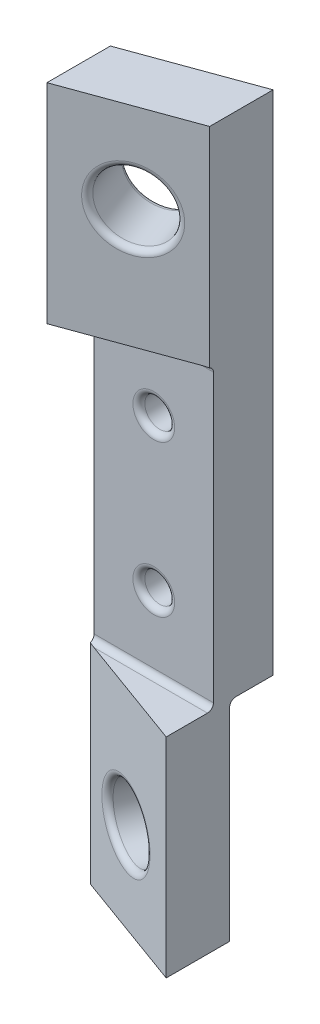
ISO-10303-21;
HEADER;
FILE_DESCRIPTION(('STEP AP214'),'2;1');
FILE_NAME('part.step','',(''),(''),'','','');
FILE_SCHEMA(('AUTOMOTIVE_DESIGN { 1 0 10303 214 1 1 1 1 }'));
ENDSEC;
DATA;
#1=APPLICATION_CONTEXT('core data for automotive mechanical design processes');
#2=APPLICATION_PROTOCOL_DEFINITION('international standard','automotive_design',2000,#1);
#3=PRODUCT_CONTEXT('',#1,'mechanical');
#4=PRODUCT('Part','Part','',(#3));
#5=PRODUCT_RELATED_PRODUCT_CATEGORY('part','',(#4));
#6=PRODUCT_DEFINITION_FORMATION('','',#4);
#7=PRODUCT_DEFINITION_CONTEXT('part definition',#1,'design');
#8=PRODUCT_DEFINITION('design','',#6,#7);
#9=PRODUCT_DEFINITION_SHAPE('','',#8);
#10=(LENGTH_UNIT() NAMED_UNIT(*) SI_UNIT(.MILLI.,.METRE.));
#11=(NAMED_UNIT(*) PLANE_ANGLE_UNIT() SI_UNIT($,.RADIAN.));
#12=(NAMED_UNIT(*) SI_UNIT($,.STERADIAN.) SOLID_ANGLE_UNIT());
#13=UNCERTAINTY_MEASURE_WITH_UNIT(LENGTH_MEASURE(1.E-05),#10,'distance_accuracy_value','');
#14=(GEOMETRIC_REPRESENTATION_CONTEXT(3) GLOBAL_UNCERTAINTY_ASSIGNED_CONTEXT((#13)) GLOBAL_UNIT_ASSIGNED_CONTEXT((#10,
#11,#12)) REPRESENTATION_CONTEXT('',''));
#15=CARTESIAN_POINT('',(0.,0.,0.));
#16=DIRECTION('',(0.,0.,1.));
#17=DIRECTION('',(1.,0.,0.));
#18=AXIS2_PLACEMENT_3D('',#15,#16,#17);
#19=CARTESIAN_POINT('',(-10.,25.,10.));
#20=DIRECTION('',(0.,-1.,0.));
#21=DIRECTION('',(1.,0.,0.));
#22=AXIS2_PLACEMENT_3D('',#19,#20,#21);
#23=PLANE('',#22);
#24=DIRECTION('',(0.,0.,-1.));
#25=VECTOR('',#24,1.);
#26=CARTESIAN_POINT('',(-10.,25.,10.));
#27=LINE('',#26,#25);
#28=CARTESIAN_POINT('',(-10.,25.,6.21522691284815));
#29=VERTEX_POINT('',#28);
#30=CARTESIAN_POINT('',(-10.,25.,0.));
#31=VERTEX_POINT('',#30);
#32=EDGE_CURVE('E215',#29,#31,#27,.T.);
#33=ORIENTED_EDGE('',*,*,#32,.F.);
#34=DIRECTION('',(-0.939692620785908,0.,0.342020143325669));
#35=VECTOR('',#34,1.);
#36=CARTESIAN_POINT('',(9.65797985667433,25.,-0.939692620785908));
#37=LINE('',#36,#35);
#38=CARTESIAN_POINT('',(7.07619559983692,25.,0.));
#39=VERTEX_POINT('',#38);
#40=EDGE_CURVE('E257',#29,#39,#37,.F.);
#41=ORIENTED_EDGE('',*,*,#40,.T.);
#42=DIRECTION('',(-1.,0.,0.));
#43=VECTOR('',#42,1.);
#44=CARTESIAN_POINT('',(-10.,25.,0.));
#45=LINE('',#44,#43);
#46=EDGE_CURVE('E196',#39,#31,#45,.T.);
#47=ORIENTED_EDGE('',*,*,#46,.T.);
#48=EDGE_LOOP('',(#33,#41,#47));
#49=FACE_BOUND('',#48,.T.);
#50=ADVANCED_FACE('F39',(#49),#23,.F.);
#51=CARTESIAN_POINT('',(-10.,-25.,10.));
#52=DIRECTION('',(0.,1.,0.));
#53=DIRECTION('',(-1.,0.,0.));
#54=AXIS2_PLACEMENT_3D('',#51,#52,#53);
#55=PLANE('',#54);
#56=DIRECTION('',(0.,0.,-1.));
#57=VECTOR('',#56,1.);
#58=CARTESIAN_POINT('',(10.,-25.,10.));
#59=LINE('',#58,#57);
#60=CARTESIAN_POINT('',(10.,-25.,6.21522691284816));
#61=VERTEX_POINT('',#60);
#62=CARTESIAN_POINT('',(10.,-25.,0.));
#63=VERTEX_POINT('',#62);
#64=EDGE_CURVE('E205',#61,#63,#59,.T.);
#65=ORIENTED_EDGE('',*,*,#64,.F.);
#66=DIRECTION('',(0.939692620785908,0.,0.34202014332567));
#67=VECTOR('',#66,1.);
#68=CARTESIAN_POINT('',(-9.65797985667433,-25.,-0.939692620785908));
#69=LINE('',#68,#67);
#70=CARTESIAN_POINT('',(-7.07619559983692,-25.,0.));
#71=VERTEX_POINT('',#70);
#72=EDGE_CURVE('E237',#61,#71,#69,.F.);
#73=ORIENTED_EDGE('',*,*,#72,.T.);
#74=DIRECTION('',(1.,0.,0.));
#75=VECTOR('',#74,1.);
#76=CARTESIAN_POINT('',(-10.,-25.,0.));
#77=LINE('',#76,#75);
#78=EDGE_CURVE('E210',#71,#63,#77,.T.);
#79=ORIENTED_EDGE('',*,*,#78,.T.);
#80=EDGE_LOOP('',(#65,#73,#79));
#81=FACE_BOUND('',#80,.T.);
#82=ADVANCED_FACE('F311',(#81),#55,.F.);
#83=CARTESIAN_POINT('',(0.,0.,10.));
#84=DIRECTION('',(0.,0.,1.));
#85=DIRECTION('',(1.,0.,0.));
#86=AXIS2_PLACEMENT_3D('',#83,#84,#85);
#87=PLANE('',#86);
#88=CARTESIAN_POINT('',(0.,-12.7,10.));
#89=DIRECTION('',(0.,0.,1.));
#90=DIRECTION('',(1.,0.,0.));
#91=AXIS2_PLACEMENT_3D('',#88,#89,#90);
#92=CIRCLE('',#91,3.5);
#93=CARTESIAN_POINT('',(3.5,-12.7,10.));
#94=VERTEX_POINT('',#93);
#95=EDGE_CURVE('E11',#94,#94,#92,.F.);
#96=ORIENTED_EDGE('',*,*,#95,.T.);
#97=EDGE_LOOP('',(#96));
#98=FACE_BOUND('',#97,.T.);
#99=CARTESIAN_POINT('',(0.,12.7,10.));
#100=DIRECTION('',(0.,0.,1.));
#101=DIRECTION('',(1.,0.,0.));
#102=AXIS2_PLACEMENT_3D('',#99,#100,#101);
#103=CIRCLE('',#102,3.5);
#104=CARTESIAN_POINT('',(3.5,12.7,10.));
#105=VERTEX_POINT('',#104);
#106=EDGE_CURVE('E294',#105,#105,#103,.F.);
#107=ORIENTED_EDGE('',*,*,#106,.T.);
#108=EDGE_LOOP('',(#107));
#109=FACE_BOUND('',#108,.T.);
#110=DIRECTION('',(0.,-1.,0.));
#111=VECTOR('',#110,1.);
#112=CARTESIAN_POINT('',(-10.,-25.,10.));
#113=LINE('',#112,#111);
#114=CARTESIAN_POINT('',(-10.,24.,10.));
#115=VERTEX_POINT('',#114);
#116=CARTESIAN_POINT('',(-10.,-24.,10.));
#117=VERTEX_POINT('',#116);
#118=EDGE_CURVE('E200',#115,#117,#113,.T.);
#119=ORIENTED_EDGE('',*,*,#118,.T.);
#120=DIRECTION('',(1.,0.,0.));
#121=VECTOR('',#120,1.);
#122=CARTESIAN_POINT('',(0.,-24.,10.));
#123=LINE('',#122,#121);
#124=CARTESIAN_POINT('',(10.,-24.,10.));
#125=VERTEX_POINT('',#124);
#126=EDGE_CURVE('E243',#117,#125,#123,.T.);
#127=ORIENTED_EDGE('',*,*,#126,.T.);
#128=DIRECTION('',(0.,1.,0.));
#129=VECTOR('',#128,1.);
#130=CARTESIAN_POINT('',(10.,-25.,10.));
#131=LINE('',#130,#129);
#132=CARTESIAN_POINT('',(10.,24.,10.));
#133=VERTEX_POINT('',#132);
#134=EDGE_CURVE('E199',#125,#133,#131,.T.);
#135=ORIENTED_EDGE('',*,*,#134,.T.);
#136=DIRECTION('',(-1.,0.,0.));
#137=VECTOR('',#136,1.);
#138=CARTESIAN_POINT('',(0.,24.,10.));
#139=LINE('',#138,#137);
#140=EDGE_CURVE('E219',#133,#115,#139,.T.);
#141=ORIENTED_EDGE('',*,*,#140,.T.);
#142=EDGE_LOOP('',(#119,#127,#135,#141));
#143=FACE_BOUND('',#142,.T.);
#144=ADVANCED_FACE('F325',(#98,#109,#143),#87,.T.);
#145=CARTESIAN_POINT('',(0.,0.,0.));
#146=DIRECTION('',(0.,0.,1.));
#147=DIRECTION('',(1.,0.,0.));
#148=AXIS2_PLACEMENT_3D('',#145,#146,#147);
#149=PLANE('',#148);
#150=CARTESIAN_POINT('',(0.,-12.7,0.));
#151=DIRECTION('',(0.,0.,1.));
#152=DIRECTION('',(1.,0.,0.));
#153=AXIS2_PLACEMENT_3D('',#150,#151,#152);
#154=CIRCLE('',#153,3.5);
#155=CARTESIAN_POINT('',(3.5,-12.7,0.));
#156=VERTEX_POINT('',#155);
#157=EDGE_CURVE('E287',#156,#156,#154,.T.);
#158=ORIENTED_EDGE('',*,*,#157,.T.);
#159=EDGE_LOOP('',(#158));
#160=FACE_BOUND('',#159,.T.);
#161=CARTESIAN_POINT('',(0.,12.7,0.));
#162=DIRECTION('',(0.,0.,1.));
#163=DIRECTION('',(1.,0.,0.));
#164=AXIS2_PLACEMENT_3D('',#161,#162,#163);
#165=CIRCLE('',#164,3.5);
#166=CARTESIAN_POINT('',(3.5,12.7,0.));
#167=VERTEX_POINT('',#166);
#168=EDGE_CURVE('E211',#167,#167,#165,.T.);
#169=ORIENTED_EDGE('',*,*,#168,.T.);
#170=EDGE_LOOP('',(#169));
#171=FACE_BOUND('',#170,.T.);
#172=ORIENTED_EDGE('',*,*,#46,.F.);
#173=CARTESIAN_POINT('',(7.07619559983692,26.,0.));
#174=DIRECTION('',(0.,0.,1.));
#175=DIRECTION('',(1.,0.,0.));
#176=AXIS2_PLACEMENT_3D('',#173,#174,#175);
#177=ELLIPSE('',#176,2.92380440016308,1.);
#178=CARTESIAN_POINT('',(10.,26.,0.));
#179=VERTEX_POINT('',#178);
#180=EDGE_CURVE('E259',#39,#179,#177,.T.);
#181=ORIENTED_EDGE('',*,*,#180,.T.);
#182=DIRECTION('',(0.,1.,0.));
#183=VECTOR('',#182,1.);
#184=CARTESIAN_POINT('',(10.,-25.,0.));
#185=LINE('',#184,#183);
#186=EDGE_CURVE('E53',#63,#179,#185,.T.);
#187=ORIENTED_EDGE('',*,*,#186,.F.);
#188=ORIENTED_EDGE('',*,*,#78,.F.);
#189=CARTESIAN_POINT('',(-7.07619559983692,-26.,0.));
#190=DIRECTION('',(0.,0.,1.));
#191=DIRECTION('',(-1.,0.,0.));
#192=AXIS2_PLACEMENT_3D('',#189,#190,#191);
#193=ELLIPSE('',#192,2.92380440016308,1.);
#194=CARTESIAN_POINT('',(-10.,-26.,0.));
#195=VERTEX_POINT('',#194);
#196=EDGE_CURVE('E238',#71,#195,#193,.T.);
#197=ORIENTED_EDGE('',*,*,#196,.T.);
#198=DIRECTION('',(0.,-1.,0.));
#199=VECTOR('',#198,1.);
#200=CARTESIAN_POINT('',(-10.,-25.,0.));
#201=LINE('',#200,#199);
#202=EDGE_CURVE('E204',#31,#195,#201,.T.);
#203=ORIENTED_EDGE('',*,*,#202,.F.);
#204=EDGE_LOOP('',(#172,#181,#187,#188,#197,#203));
#205=FACE_BOUND('',#204,.T.);
#206=ADVANCED_FACE('F371',(#160,#171,#205),#149,.F.);
#207=CARTESIAN_POINT('',(-10.,-25.,10.));
#208=DIRECTION('',(1.,0.,0.));
#209=DIRECTION('',(0.,0.,-1.));
#210=AXIS2_PLACEMENT_3D('',#207,#208,#209);
#211=PLANE('',#210);
#212=ORIENTED_EDGE('',*,*,#202,.T.);
#213=DIRECTION('',(0.,1.,0.));
#214=VECTOR('',#213,1.);
#215=CARTESIAN_POINT('',(-9.99999999999999,-60.,0.));
#216=LINE('',#215,#214);
#217=CARTESIAN_POINT('',(-9.99999999999999,-60.,0.));
#218=VERTEX_POINT('',#217);
#219=EDGE_CURVE('E191',#218,#195,#216,.T.);
#220=ORIENTED_EDGE('',*,*,#219,.F.);
#221=DIRECTION('',(0.,0.,-1.));
#222=VECTOR('',#221,1.);
#223=CARTESIAN_POINT('',(-9.99999999999999,-60.,10.6417777247591));
#224=LINE('',#223,#222);
#225=CARTESIAN_POINT('',(-9.99999999999999,-60.,10.6417777247591));
#226=VERTEX_POINT('',#225);
#227=EDGE_CURVE('E180',#226,#218,#224,.T.);
#228=ORIENTED_EDGE('',*,*,#227,.F.);
#229=DIRECTION('',(0.,1.,0.));
#230=VECTOR('',#229,1.);
#231=CARTESIAN_POINT('',(-9.99999999999999,-60.,10.6417777247591));
#232=LINE('',#231,#230);
#233=CARTESIAN_POINT('',(-10.,-24.9336363325843,10.6417777247591));
#234=VERTEX_POINT('',#233);
#235=EDGE_CURVE('E192',#226,#234,#232,.T.);
#236=ORIENTED_EDGE('',*,*,#235,.T.);
#237=CARTESIAN_POINT('',(-10.,-24.,11.));
#238=DIRECTION('',(1.,0.,0.));
#239=DIRECTION('',(0.,0.,-1.));
#240=AXIS2_PLACEMENT_3D('',#237,#238,#239);
#241=CIRCLE('',#240,1.);
#242=EDGE_CURVE('E255',#234,#117,#241,.T.);
#243=ORIENTED_EDGE('',*,*,#242,.T.);
#244=ORIENTED_EDGE('',*,*,#118,.F.);
#245=CARTESIAN_POINT('',(-10.,24.,11.));
#246=DIRECTION('',(1.,0.,0.));
#247=DIRECTION('',(0.,0.,-1.));
#248=AXIS2_PLACEMENT_3D('',#245,#246,#247);
#249=CIRCLE('',#248,1.);
#250=CARTESIAN_POINT('',(-10.,25.,11.));
#251=VERTEX_POINT('',#250);
#252=EDGE_CURVE('E223',#115,#251,#249,.T.);
#253=ORIENTED_EDGE('',*,*,#252,.T.);
#254=DIRECTION('',(0.,0.,1.));
#255=VECTOR('',#254,1.);
#256=CARTESIAN_POINT('',(-10.,25.,7.27940468532407));
#257=LINE('',#256,#255);
#258=CARTESIAN_POINT('',(-10.,25.,17.9211824100832));
#259=VERTEX_POINT('',#258);
#260=EDGE_CURVE('E388',#251,#259,#257,.T.);
#261=ORIENTED_EDGE('',*,*,#260,.T.);
#262=DIRECTION('',(0.,-1.,0.));
#263=VECTOR('',#262,1.);
#264=CARTESIAN_POINT('',(-9.99999999999999,60.,17.9211824100832));
#265=LINE('',#264,#263);
#266=CARTESIAN_POINT('',(-9.99999999999999,60.,17.9211824100832));
#267=VERTEX_POINT('',#266);
#268=EDGE_CURVE('E171',#267,#259,#265,.T.);
#269=ORIENTED_EDGE('',*,*,#268,.F.);
#270=DIRECTION('',(0.,0.,1.));
#271=VECTOR('',#270,1.);
#272=CARTESIAN_POINT('',(-9.99999999999999,60.,7.27940468532407));
#273=LINE('',#272,#271);
#274=CARTESIAN_POINT('',(-9.99999999999999,60.,7.27940468532407));
#275=VERTEX_POINT('',#274);
#276=EDGE_CURVE('E154',#275,#267,#273,.T.);
#277=ORIENTED_EDGE('',*,*,#276,.F.);
#278=DIRECTION('',(0.,-1.,0.));
#279=VECTOR('',#278,1.);
#280=CARTESIAN_POINT('',(-9.99999999999999,60.,7.27940468532407));
#281=LINE('',#280,#279);
#282=CARTESIAN_POINT('',(-10.,26.,7.27940468532407));
#283=VERTEX_POINT('',#282);
#284=EDGE_CURVE('E155',#275,#283,#281,.T.);
#285=ORIENTED_EDGE('',*,*,#284,.T.);
#286=CARTESIAN_POINT('',(-10.,26.,6.21522691284815));
#287=DIRECTION('',(1.,0.,0.));
#288=DIRECTION('',(0.,0.,-1.));
#289=AXIS2_PLACEMENT_3D('',#286,#287,#288);
#290=ELLIPSE('',#289,1.06417777247591,1.);
#291=EDGE_CURVE('E65',#283,#29,#290,.T.);
#292=ORIENTED_EDGE('',*,*,#291,.T.);
#293=ORIENTED_EDGE('',*,*,#32,.T.);
#294=EDGE_LOOP('',(#212,#220,#228,#236,#243,#244,#253,#261,#269,#277,#285,#292,#293));
#295=FACE_BOUND('',#294,.T.);
#296=ADVANCED_FACE('F329',(#295),#211,.F.);
#297=CARTESIAN_POINT('',(10.,-25.,10.));
#298=DIRECTION('',(-1.,0.,0.));
#299=DIRECTION('',(0.,0.,1.));
#300=AXIS2_PLACEMENT_3D('',#297,#298,#299);
#301=PLANE('',#300);
#302=ORIENTED_EDGE('',*,*,#186,.T.);
#303=DIRECTION('',(0.,-1.,0.));
#304=VECTOR('',#303,1.);
#305=CARTESIAN_POINT('',(10.,60.,0.));
#306=LINE('',#305,#304);
#307=CARTESIAN_POINT('',(10.,60.,0.));
#308=VERTEX_POINT('',#307);
#309=EDGE_CURVE('E148',#308,#179,#306,.T.);
#310=ORIENTED_EDGE('',*,*,#309,.F.);
#311=DIRECTION('',(0.,0.,-1.));
#312=VECTOR('',#311,1.);
#313=CARTESIAN_POINT('',(10.,60.,10.6417777247591));
#314=LINE('',#313,#312);
#315=CARTESIAN_POINT('',(10.,60.,10.6417777247591));
#316=VERTEX_POINT('',#315);
#317=EDGE_CURVE('E157',#316,#308,#314,.T.);
#318=ORIENTED_EDGE('',*,*,#317,.F.);
#319=DIRECTION('',(0.,-1.,0.));
#320=VECTOR('',#319,1.);
#321=CARTESIAN_POINT('',(10.,60.,10.6417777247591));
#322=LINE('',#321,#320);
#323=CARTESIAN_POINT('',(10.,24.9336363325843,10.6417777247591));
#324=VERTEX_POINT('',#323);
#325=EDGE_CURVE('E390',#316,#324,#322,.T.);
#326=ORIENTED_EDGE('',*,*,#325,.T.);
#327=CARTESIAN_POINT('',(10.,24.,11.));
#328=DIRECTION('',(-1.,0.,0.));
#329=DIRECTION('',(0.,0.,1.));
#330=AXIS2_PLACEMENT_3D('',#327,#328,#329);
#331=CIRCLE('',#330,1.);
#332=EDGE_CURVE('E229',#324,#133,#331,.T.);
#333=ORIENTED_EDGE('',*,*,#332,.T.);
#334=ORIENTED_EDGE('',*,*,#134,.F.);
#335=CARTESIAN_POINT('',(10.,-24.,11.));
#336=DIRECTION('',(-1.,0.,0.));
#337=DIRECTION('',(0.,0.,1.));
#338=AXIS2_PLACEMENT_3D('',#335,#336,#337);
#339=CIRCLE('',#338,1.);
#340=CARTESIAN_POINT('',(10.,-25.,11.));
#341=VERTEX_POINT('',#340);
#342=EDGE_CURVE('E248',#125,#341,#339,.T.);
#343=ORIENTED_EDGE('',*,*,#342,.T.);
#344=DIRECTION('',(0.,0.,1.));
#345=VECTOR('',#344,1.);
#346=CARTESIAN_POINT('',(10.,-25.,7.27940468532407));
#347=LINE('',#346,#345);
#348=CARTESIAN_POINT('',(10.,-25.,17.9211824100832));
#349=VERTEX_POINT('',#348);
#350=EDGE_CURVE('E167',#341,#349,#347,.T.);
#351=ORIENTED_EDGE('',*,*,#350,.T.);
#352=DIRECTION('',(0.,1.,0.));
#353=VECTOR('',#352,1.);
#354=CARTESIAN_POINT('',(10.,-60.,17.9211824100832));
#355=LINE('',#354,#353);
#356=CARTESIAN_POINT('',(10.,-60.,17.9211824100832));
#357=VERTEX_POINT('',#356);
#358=EDGE_CURVE('E181',#357,#349,#355,.T.);
#359=ORIENTED_EDGE('',*,*,#358,.F.);
#360=DIRECTION('',(0.,0.,1.));
#361=VECTOR('',#360,1.);
#362=CARTESIAN_POINT('',(10.,-60.,7.27940468532407));
#363=LINE('',#362,#361);
#364=CARTESIAN_POINT('',(10.,-60.,7.27940468532407));
#365=VERTEX_POINT('',#364);
#366=EDGE_CURVE('E182',#365,#357,#363,.T.);
#367=ORIENTED_EDGE('',*,*,#366,.F.);
#368=DIRECTION('',(0.,1.,0.));
#369=VECTOR('',#368,1.);
#370=CARTESIAN_POINT('',(10.,-60.,7.27940468532407));
#371=LINE('',#370,#369);
#372=CARTESIAN_POINT('',(10.,-26.,7.27940468532407));
#373=VERTEX_POINT('',#372);
#374=EDGE_CURVE('E186',#365,#373,#371,.T.);
#375=ORIENTED_EDGE('',*,*,#374,.T.);
#376=CARTESIAN_POINT('',(10.,-26.,6.21522691284816));
#377=DIRECTION('',(-1.,0.,0.));
#378=DIRECTION('',(0.,0.,-1.));
#379=AXIS2_PLACEMENT_3D('',#376,#377,#378);
#380=ELLIPSE('',#379,1.06417777247591,1.);
#381=EDGE_CURVE('E239',#373,#61,#380,.T.);
#382=ORIENTED_EDGE('',*,*,#381,.T.);
#383=ORIENTED_EDGE('',*,*,#64,.T.);
#384=EDGE_LOOP('',(#302,#310,#318,#326,#333,#334,#343,#351,#359,#367,#375,#382,#383));
#385=FACE_BOUND('',#384,.T.);
#386=ADVANCED_FACE('F163',(#385),#301,.F.);
#387=CARTESIAN_POINT('',(0.,-12.7,10.));
#388=DIRECTION('',(0.,0.,-1.));
#389=DIRECTION('',(-1.,0.,0.));
#390=AXIS2_PLACEMENT_3D('',#387,#388,#389);
#391=CYLINDRICAL_SURFACE('',#390,2.5);
#392=CARTESIAN_POINT('',(0.,-12.7,9.));
#393=DIRECTION('',(0.,0.,1.));
#394=DIRECTION('',(1.,0.,0.));
#395=AXIS2_PLACEMENT_3D('',#392,#393,#394);
#396=CIRCLE('',#395,2.5);
#397=CARTESIAN_POINT('',(2.5,-12.7,9.));
#398=VERTEX_POINT('',#397);
#399=EDGE_CURVE('E50',#398,#398,#396,.T.);
#400=ORIENTED_EDGE('',*,*,#399,.T.);
#401=EDGE_LOOP('',(#400));
#402=FACE_BOUND('',#401,.T.);
#403=CARTESIAN_POINT('',(0.,-12.7,0.999999999999999));
#404=DIRECTION('',(0.,0.,1.));
#405=DIRECTION('',(1.,0.,0.));
#406=AXIS2_PLACEMENT_3D('',#403,#404,#405);
#407=CIRCLE('',#406,2.5);
#408=CARTESIAN_POINT('',(2.5,-12.7,0.999999999999999));
#409=VERTEX_POINT('',#408);
#410=EDGE_CURVE('E286',#409,#409,#407,.F.);
#411=ORIENTED_EDGE('',*,*,#410,.T.);
#412=EDGE_LOOP('',(#411));
#413=FACE_BOUND('',#412,.T.);
#414=ADVANCED_FACE('F298',(#402,#413),#391,.F.);
#415=CARTESIAN_POINT('',(0.,12.7,10.));
#416=DIRECTION('',(0.,0.,-1.));
#417=DIRECTION('',(-1.,0.,0.));
#418=AXIS2_PLACEMENT_3D('',#415,#416,#417);
#419=CYLINDRICAL_SURFACE('',#418,2.5);
#420=CARTESIAN_POINT('',(0.,12.7,9.));
#421=DIRECTION('',(0.,0.,1.));
#422=DIRECTION('',(1.,0.,0.));
#423=AXIS2_PLACEMENT_3D('',#420,#421,#422);
#424=CIRCLE('',#423,2.5);
#425=CARTESIAN_POINT('',(2.5,12.7,9.));
#426=VERTEX_POINT('',#425);
#427=EDGE_CURVE('E295',#426,#426,#424,.T.);
#428=ORIENTED_EDGE('',*,*,#427,.T.);
#429=EDGE_LOOP('',(#428));
#430=FACE_BOUND('',#429,.T.);
#431=CARTESIAN_POINT('',(0.,12.7,0.999999999999999));
#432=DIRECTION('',(0.,0.,1.));
#433=DIRECTION('',(1.,0.,0.));
#434=AXIS2_PLACEMENT_3D('',#431,#432,#433);
#435=CIRCLE('',#434,2.5);
#436=CARTESIAN_POINT('',(2.5,12.7,0.999999999999999));
#437=VERTEX_POINT('',#436);
#438=EDGE_CURVE('E220',#437,#437,#435,.F.);
#439=ORIENTED_EDGE('',*,*,#438,.T.);
#440=EDGE_LOOP('',(#439));
#441=FACE_BOUND('',#440,.T.);
#442=ADVANCED_FACE('F441',(#430,#441),#419,.F.);
#443=CARTESIAN_POINT('',(10.,-60.,17.9211824100832));
#444=DIRECTION('',(0.34202014332567,0.,-0.939692620785908));
#445=DIRECTION('',(-0.939692620785908,0.,-0.34202014332567));
#446=AXIS2_PLACEMENT_3D('',#443,#444,#445);
#447=PLANE('',#446);
#448=CARTESIAN_POINT('',(-0.603073792140913,-45.,14.0619791580158));
#449=DIRECTION('',(0.34202014332567,0.,-0.939692620785908));
#450=DIRECTION('',(-0.939692620785908,0.,-0.34202014332567));
#451=AXIS2_PLACEMENT_3D('',#448,#449,#450);
#452=CIRCLE('',#451,6.75);
#453=CARTESIAN_POINT('',(-6.94599898244579,-45.,11.7533431905675));
#454=VERTEX_POINT('',#453);
#455=EDGE_CURVE('E284',#454,#454,#452,.T.);
#456=ORIENTED_EDGE('',*,*,#455,.T.);
#457=EDGE_LOOP('',(#456));
#458=FACE_BOUND('',#457,.T.);
#459=DIRECTION('',(-0.939692620785908,0.,-0.34202014332567));
#460=VECTOR('',#459,1.);
#461=CARTESIAN_POINT('',(10.,-25.,17.9211824100832));
#462=LINE('',#461,#460);
#463=CARTESIAN_POINT('',(-9.01579238763003,-25.,11.));
#464=VERTEX_POINT('',#463);
#465=EDGE_CURVE('E166',#349,#464,#462,.T.);
#466=ORIENTED_EDGE('',*,*,#465,.T.);
#467=CARTESIAN_POINT('',(-9.01579238763003,-24.,11.));
#468=DIRECTION('',(0.34202014332567,0.,-0.939692620785908));
#469=DIRECTION('',(0.939692620785908,0.,0.34202014332567));
#470=AXIS2_PLACEMENT_3D('',#467,#468,#469);
#471=ELLIPSE('',#470,2.92380440016308,1.);
#472=EDGE_CURVE('E249',#464,#234,#471,.T.);
#473=ORIENTED_EDGE('',*,*,#472,.T.);
#474=ORIENTED_EDGE('',*,*,#235,.F.);
#475=DIRECTION('',(-0.939692620785908,0.,-0.34202014332567));
#476=VECTOR('',#475,1.);
#477=CARTESIAN_POINT('',(10.,-60.,17.9211824100832));
#478=LINE('',#477,#476);
#479=EDGE_CURVE('E174',#357,#226,#478,.T.);
#480=ORIENTED_EDGE('',*,*,#479,.F.);
#481=ORIENTED_EDGE('',*,*,#358,.T.);
#482=EDGE_LOOP('',(#466,#473,#474,#480,#481));
#483=FACE_BOUND('',#482,.T.);
#484=ADVANCED_FACE('F418',(#458,#483),#447,.F.);
#485=CARTESIAN_POINT('',(-9.99999999999999,-60.,0.));
#486=DIRECTION('',(-0.34202014332567,0.,0.939692620785908));
#487=DIRECTION('',(0.939692620785908,0.,0.34202014332567));
#488=AXIS2_PLACEMENT_3D('',#485,#486,#487);
#489=PLANE('',#488);
#490=CARTESIAN_POINT('',(2.81712764111579,-45.,4.66505295015674));
#491=DIRECTION('',(-0.34202014332567,0.,0.939692620785908));
#492=DIRECTION('',(0.939692620785908,0.,0.34202014332567));
#493=AXIS2_PLACEMENT_3D('',#490,#491,#492);
#494=CIRCLE('',#493,6.75);
#495=CARTESIAN_POINT('',(9.16005283142067,-45.,6.97368891760501));
#496=VERTEX_POINT('',#495);
#497=EDGE_CURVE('E272',#496,#496,#494,.T.);
#498=ORIENTED_EDGE('',*,*,#497,.T.);
#499=EDGE_LOOP('',(#498));
#500=FACE_BOUND('',#499,.T.);
#501=ORIENTED_EDGE('',*,*,#219,.T.);
#502=DIRECTION('',(0.939692620785908,0.,0.34202014332567));
#503=VECTOR('',#502,1.);
#504=CARTESIAN_POINT('',(10.,-26.,7.27940468532407));
#505=LINE('',#504,#503);
#506=EDGE_CURVE('E231',#195,#373,#505,.T.);
#507=ORIENTED_EDGE('',*,*,#506,.T.);
#508=ORIENTED_EDGE('',*,*,#374,.F.);
#509=DIRECTION('',(0.939692620785908,0.,0.34202014332567));
#510=VECTOR('',#509,1.);
#511=CARTESIAN_POINT('',(-9.99999999999999,-60.,0.));
#512=LINE('',#511,#510);
#513=EDGE_CURVE('E178',#218,#365,#512,.T.);
#514=ORIENTED_EDGE('',*,*,#513,.F.);
#515=EDGE_LOOP('',(#501,#507,#508,#514));
#516=FACE_BOUND('',#515,.T.);
#517=ADVANCED_FACE('F430',(#500,#516),#489,.F.);
#518=CARTESIAN_POINT('',(0.,-60.,0.));
#519=DIRECTION('',(0.,-1.,0.));
#520=DIRECTION('',(1.,0.,0.));
#521=AXIS2_PLACEMENT_3D('',#518,#519,#520);
#522=PLANE('',#521);
#523=ORIENTED_EDGE('',*,*,#479,.T.);
#524=ORIENTED_EDGE('',*,*,#227,.T.);
#525=ORIENTED_EDGE('',*,*,#513,.T.);
#526=ORIENTED_EDGE('',*,*,#366,.T.);
#527=EDGE_LOOP('',(#523,#524,#525,#526));
#528=FACE_BOUND('',#527,.T.);
#529=ADVANCED_FACE('F423',(#528),#522,.T.);
#530=CARTESIAN_POINT('',(0.,-25.,0.));
#531=DIRECTION('',(0.,-1.,0.));
#532=DIRECTION('',(1.,0.,0.));
#533=AXIS2_PLACEMENT_3D('',#530,#531,#532);
#534=PLANE('',#533);
#535=ORIENTED_EDGE('',*,*,#350,.F.);
#536=DIRECTION('',(1.,0.,0.));
#537=VECTOR('',#536,1.);
#538=CARTESIAN_POINT('',(0.,-25.,11.));
#539=LINE('',#538,#537);
#540=EDGE_CURVE('E246',#341,#464,#539,.F.);
#541=ORIENTED_EDGE('',*,*,#540,.T.);
#542=ORIENTED_EDGE('',*,*,#465,.F.);
#543=EDGE_LOOP('',(#535,#541,#542));
#544=FACE_BOUND('',#543,.T.);
#545=ADVANCED_FACE('F416',(#544),#534,.F.);
#546=CARTESIAN_POINT('',(11.3676312242575,-45.,-18.827262569491));
#547=DIRECTION('',(-0.34202014332567,0.,0.939692620785908));
#548=DIRECTION('',(0.939692620785908,0.,0.34202014332567));
#549=AXIS2_PLACEMENT_3D('',#546,#547,#548);
#550=CYLINDRICAL_SURFACE('',#549,5.75);
#551=CARTESIAN_POINT('',(-0.261053648815247,-45.,13.1222865372299));
#552=DIRECTION('',(0.34202014332567,0.,-0.939692620785908));
#553=DIRECTION('',(-0.939692620785908,0.,-0.34202014332567));
#554=AXIS2_PLACEMENT_3D('',#551,#552,#553);
#555=CIRCLE('',#554,5.75);
#556=CARTESIAN_POINT('',(-5.66428621833422,-45.,11.1556707131073));
#557=VERTEX_POINT('',#556);
#558=EDGE_CURVE('E279',#557,#557,#555,.F.);
#559=ORIENTED_EDGE('',*,*,#558,.T.);
#560=EDGE_LOOP('',(#559));
#561=FACE_BOUND('',#560,.T.);
#562=CARTESIAN_POINT('',(2.47510749779012,-45.,5.60474557094265));
#563=DIRECTION('',(-0.34202014332567,0.,0.939692620785908));
#564=DIRECTION('',(0.939692620785908,0.,0.34202014332567));
#565=AXIS2_PLACEMENT_3D('',#562,#563,#564);
#566=CIRCLE('',#565,5.75);
#567=CARTESIAN_POINT('',(7.87834006730909,-45.,7.57136139506525));
#568=VERTEX_POINT('',#567);
#569=EDGE_CURVE('E280',#568,#568,#566,.F.);
#570=ORIENTED_EDGE('',*,*,#569,.T.);
#571=EDGE_LOOP('',(#570));
#572=FACE_BOUND('',#571,.T.);
#573=ADVANCED_FACE('F483',(#561,#572),#550,.F.);
#574=CARTESIAN_POINT('',(10.,60.,0.));
#575=DIRECTION('',(0.342020143325669,0.,0.939692620785908));
#576=DIRECTION('',(0.939692620785908,0.,-0.342020143325669));
#577=AXIS2_PLACEMENT_3D('',#574,#575,#576);
#578=PLANE('',#577);
#579=CARTESIAN_POINT('',(-2.81712764111577,45.,4.66505295015674));
#580=DIRECTION('',(0.342020143325669,0.,0.939692620785908));
#581=DIRECTION('',(0.939692620785908,0.,-0.342020143325669));
#582=AXIS2_PLACEMENT_3D('',#579,#580,#581);
#583=CIRCLE('',#582,6.75);
#584=CARTESIAN_POINT('',(3.52579754918911,45.,2.35641698270847));
#585=VERTEX_POINT('',#584);
#586=EDGE_CURVE('E265',#585,#585,#583,.T.);
#587=ORIENTED_EDGE('',*,*,#586,.T.);
#588=EDGE_LOOP('',(#587));
#589=FACE_BOUND('',#588,.T.);
#590=ORIENTED_EDGE('',*,*,#309,.T.);
#591=DIRECTION('',(-0.939692620785908,0.,0.342020143325669));
#592=VECTOR('',#591,1.);
#593=CARTESIAN_POINT('',(-10.,26.,7.27940468532407));
#594=LINE('',#593,#592);
#595=EDGE_CURVE('E253',#179,#283,#594,.T.);
#596=ORIENTED_EDGE('',*,*,#595,.T.);
#597=ORIENTED_EDGE('',*,*,#284,.F.);
#598=DIRECTION('',(-0.939692620785908,0.,0.34202014332567));
#599=VECTOR('',#598,1.);
#600=CARTESIAN_POINT('',(10.,60.,0.));
#601=LINE('',#600,#599);
#602=EDGE_CURVE('E147',#308,#275,#601,.T.);
#603=ORIENTED_EDGE('',*,*,#602,.F.);
#604=EDGE_LOOP('',(#590,#596,#597,#603));
#605=FACE_BOUND('',#604,.T.);
#606=ADVANCED_FACE('F149',(#589,#605),#578,.F.);
#607=CARTESIAN_POINT('',(-9.99999999999999,60.,17.9211824100832));
#608=DIRECTION('',(-0.34202014332567,0.,-0.939692620785908));
#609=DIRECTION('',(-0.939692620785908,0.,0.34202014332567));
#610=AXIS2_PLACEMENT_3D('',#607,#608,#609);
#611=PLANE('',#610);
#612=CARTESIAN_POINT('',(0.603073792140929,45.,14.0619791580158));
#613=DIRECTION('',(-0.34202014332567,0.,-0.939692620785908));
#614=DIRECTION('',(-0.939692620785908,0.,0.34202014332567));
#615=AXIS2_PLACEMENT_3D('',#612,#613,#614);
#616=CIRCLE('',#615,6.75);
#617=CARTESIAN_POINT('',(-5.73985139816395,45.,16.3706151254641));
#618=VERTEX_POINT('',#617);
#619=EDGE_CURVE('E271',#618,#618,#616,.T.);
#620=ORIENTED_EDGE('',*,*,#619,.T.);
#621=EDGE_LOOP('',(#620));
#622=FACE_BOUND('',#621,.T.);
#623=DIRECTION('',(0.939692620785908,0.,-0.34202014332567));
#624=VECTOR('',#623,1.);
#625=CARTESIAN_POINT('',(-10.,25.,17.9211824100832));
#626=LINE('',#625,#624);
#627=CARTESIAN_POINT('',(9.01579238763004,25.,11.));
#628=VERTEX_POINT('',#627);
#629=EDGE_CURVE('E164',#259,#628,#626,.T.);
#630=ORIENTED_EDGE('',*,*,#629,.T.);
#631=CARTESIAN_POINT('',(9.01579238763004,24.,11.));
#632=DIRECTION('',(-0.34202014332567,0.,-0.939692620785908));
#633=DIRECTION('',(-0.939692620785908,0.,0.34202014332567));
#634=AXIS2_PLACEMENT_3D('',#631,#632,#633);
#635=ELLIPSE('',#634,2.92380440016308,1.);
#636=EDGE_CURVE('E230',#628,#324,#635,.T.);
#637=ORIENTED_EDGE('',*,*,#636,.T.);
#638=ORIENTED_EDGE('',*,*,#325,.F.);
#639=DIRECTION('',(0.939692620785908,0.,-0.34202014332567));
#640=VECTOR('',#639,1.);
#641=CARTESIAN_POINT('',(-9.99999999999999,60.,17.9211824100832));
#642=LINE('',#641,#640);
#643=EDGE_CURVE('E162',#267,#316,#642,.T.);
#644=ORIENTED_EDGE('',*,*,#643,.F.);
#645=ORIENTED_EDGE('',*,*,#268,.T.);
#646=EDGE_LOOP('',(#630,#637,#638,#644,#645));
#647=FACE_BOUND('',#646,.T.);
#648=ADVANCED_FACE('F396',(#622,#647),#611,.F.);
#649=CARTESIAN_POINT('',(0.,60.,0.));
#650=DIRECTION('',(0.,1.,0.));
#651=DIRECTION('',(-1.,0.,0.));
#652=AXIS2_PLACEMENT_3D('',#649,#650,#651);
#653=PLANE('',#652);
#654=ORIENTED_EDGE('',*,*,#317,.T.);
#655=ORIENTED_EDGE('',*,*,#602,.T.);
#656=ORIENTED_EDGE('',*,*,#276,.T.);
#657=ORIENTED_EDGE('',*,*,#643,.T.);
#658=EDGE_LOOP('',(#654,#655,#656,#657));
#659=FACE_BOUND('',#658,.T.);
#660=ADVANCED_FACE('F159',(#659),#653,.T.);
#661=CARTESIAN_POINT('',(0.,25.,0.));
#662=DIRECTION('',(0.,1.,0.));
#663=DIRECTION('',(-1.,0.,0.));
#664=AXIS2_PLACEMENT_3D('',#661,#662,#663);
#665=PLANE('',#664);
#666=ORIENTED_EDGE('',*,*,#260,.F.);
#667=DIRECTION('',(-1.,0.,0.));
#668=VECTOR('',#667,1.);
#669=CARTESIAN_POINT('',(0.,25.,11.));
#670=LINE('',#669,#668);
#671=EDGE_CURVE('E224',#251,#628,#670,.F.);
#672=ORIENTED_EDGE('',*,*,#671,.T.);
#673=ORIENTED_EDGE('',*,*,#629,.F.);
#674=EDGE_LOOP('',(#666,#672,#673));
#675=FACE_BOUND('',#674,.T.);
#676=ADVANCED_FACE('F399',(#675),#665,.F.);
#677=CARTESIAN_POINT('',(-11.3676312242575,45.,-18.827262569491));
#678=DIRECTION('',(0.34202014332567,0.,0.939692620785908));
#679=DIRECTION('',(0.939692620785908,0.,-0.34202014332567));
#680=AXIS2_PLACEMENT_3D('',#677,#678,#679);
#681=CYLINDRICAL_SURFACE('',#680,5.75);
#682=CARTESIAN_POINT('',(0.261053648815259,45.,13.1222865372299));
#683=DIRECTION('',(-0.34202014332567,0.,-0.939692620785908));
#684=DIRECTION('',(-0.939692620785908,0.,0.34202014332567));
#685=AXIS2_PLACEMENT_3D('',#682,#683,#684);
#686=CIRCLE('',#685,5.75);
#687=CARTESIAN_POINT('',(-5.14217892070371,45.,15.0889023613525));
#688=VERTEX_POINT('',#687);
#689=EDGE_CURVE('E268',#688,#688,#686,.F.);
#690=ORIENTED_EDGE('',*,*,#689,.T.);
#691=EDGE_LOOP('',(#690));
#692=FACE_BOUND('',#691,.T.);
#693=CARTESIAN_POINT('',(-2.4751074977901,45.,5.60474557094265));
#694=DIRECTION('',(0.342020143325669,0.,0.939692620785908));
#695=DIRECTION('',(0.939692620785908,0.,-0.342020143325669));
#696=AXIS2_PLACEMENT_3D('',#693,#694,#695);
#697=CIRCLE('',#696,5.75);
#698=CARTESIAN_POINT('',(2.92812507172887,45.,3.63812974682005));
#699=VERTEX_POINT('',#698);
#700=EDGE_CURVE('E262',#699,#699,#697,.F.);
#701=ORIENTED_EDGE('',*,*,#700,.T.);
#702=EDGE_LOOP('',(#701));
#703=FACE_BOUND('',#702,.T.);
#704=ADVANCED_FACE('F332',(#692,#703),#681,.F.);
#705=CARTESIAN_POINT('',(0.,12.7,0.999999999999999));
#706=DIRECTION('',(0.,0.,1.));
#707=DIRECTION('',(1.,0.,0.));
#708=AXIS2_PLACEMENT_3D('',#705,#706,#707);
#709=TOROIDAL_SURFACE('',#708,3.5,1.);
#710=ORIENTED_EDGE('',*,*,#438,.F.);
#711=EDGE_LOOP('',(#710));
#712=FACE_BOUND('',#711,.T.);
#713=ORIENTED_EDGE('',*,*,#168,.F.);
#714=EDGE_LOOP('',(#713));
#715=FACE_BOUND('',#714,.T.);
#716=ADVANCED_FACE('F330',(#712,#715),#709,.T.);
#717=CARTESIAN_POINT('',(0.,24.,11.));
#718=DIRECTION('',(-1.,0.,0.));
#719=DIRECTION('',(0.,-1.,0.));
#720=AXIS2_PLACEMENT_3D('',#717,#718,#719);
#721=CYLINDRICAL_SURFACE('',#720,1.);
#722=ORIENTED_EDGE('',*,*,#636,.F.);
#723=ORIENTED_EDGE('',*,*,#671,.F.);
#724=ORIENTED_EDGE('',*,*,#252,.F.);
#725=ORIENTED_EDGE('',*,*,#140,.F.);
#726=ORIENTED_EDGE('',*,*,#332,.F.);
#727=EDGE_LOOP('',(#722,#723,#724,#725,#726));
#728=FACE_BOUND('',#727,.T.);
#729=ADVANCED_FACE('F333',(#728),#721,.F.);
#730=CARTESIAN_POINT('',(-9.65797985667433,-26.,-0.939692620785908));
#731=DIRECTION('',(-0.939692620785908,0.,-0.34202014332567));
#732=DIRECTION('',(-0.34202014332567,0.,0.939692620785908));
#733=AXIS2_PLACEMENT_3D('',#730,#731,#732);
#734=CYLINDRICAL_SURFACE('',#733,1.);
#735=ORIENTED_EDGE('',*,*,#196,.F.);
#736=ORIENTED_EDGE('',*,*,#72,.F.);
#737=ORIENTED_EDGE('',*,*,#381,.F.);
#738=ORIENTED_EDGE('',*,*,#506,.F.);
#739=EDGE_LOOP('',(#735,#736,#737,#738));
#740=FACE_BOUND('',#739,.T.);
#741=ADVANCED_FACE('F338',(#740),#734,.F.);
#742=CARTESIAN_POINT('',(0.,-24.,11.));
#743=DIRECTION('',(1.,0.,0.));
#744=DIRECTION('',(0.,1.,0.));
#745=AXIS2_PLACEMENT_3D('',#742,#743,#744);
#746=CYLINDRICAL_SURFACE('',#745,1.);
#747=ORIENTED_EDGE('',*,*,#472,.F.);
#748=ORIENTED_EDGE('',*,*,#540,.F.);
#749=ORIENTED_EDGE('',*,*,#342,.F.);
#750=ORIENTED_EDGE('',*,*,#126,.F.);
#751=ORIENTED_EDGE('',*,*,#242,.F.);
#752=EDGE_LOOP('',(#747,#748,#749,#750,#751));
#753=FACE_BOUND('',#752,.T.);
#754=ADVANCED_FACE('F337',(#753),#746,.F.);
#755=CARTESIAN_POINT('',(9.65797985667433,26.,-0.939692620785908));
#756=DIRECTION('',(0.939692620785908,0.,-0.342020143325669));
#757=DIRECTION('',(-0.342020143325669,0.,-0.939692620785908));
#758=AXIS2_PLACEMENT_3D('',#755,#756,#757);
#759=CYLINDRICAL_SURFACE('',#758,1.);
#760=ORIENTED_EDGE('',*,*,#180,.F.);
#761=ORIENTED_EDGE('',*,*,#40,.F.);
#762=ORIENTED_EDGE('',*,*,#291,.F.);
#763=ORIENTED_EDGE('',*,*,#595,.F.);
#764=EDGE_LOOP('',(#760,#761,#762,#763));
#765=FACE_BOUND('',#764,.T.);
#766=ADVANCED_FACE('F343',(#765),#759,.F.);
#767=CARTESIAN_POINT('',(-2.4751074977901,45.,5.60474557094265));
#768=DIRECTION('',(0.342020143325669,0.,0.939692620785908));
#769=DIRECTION('',(0.939692620785908,0.,-0.342020143325669));
#770=AXIS2_PLACEMENT_3D('',#767,#768,#769);
#771=TOROIDAL_SURFACE('',#770,6.75,1.);
#772=ORIENTED_EDGE('',*,*,#700,.F.);
#773=EDGE_LOOP('',(#772));
#774=FACE_BOUND('',#773,.T.);
#775=ORIENTED_EDGE('',*,*,#586,.F.);
#776=EDGE_LOOP('',(#775));
#777=FACE_BOUND('',#776,.T.);
#778=ADVANCED_FACE('F350',(#774,#777),#771,.T.);
#779=CARTESIAN_POINT('',(0.261053648815259,45.,13.1222865372299));
#780=DIRECTION('',(-0.34202014332567,0.,-0.939692620785908));
#781=DIRECTION('',(-0.939692620785908,0.,0.34202014332567));
#782=AXIS2_PLACEMENT_3D('',#779,#780,#781);
#783=TOROIDAL_SURFACE('',#782,6.75,1.);
#784=ORIENTED_EDGE('',*,*,#619,.F.);
#785=EDGE_LOOP('',(#784));
#786=FACE_BOUND('',#785,.T.);
#787=ORIENTED_EDGE('',*,*,#689,.F.);
#788=EDGE_LOOP('',(#787));
#789=FACE_BOUND('',#788,.T.);
#790=ADVANCED_FACE('F351',(#786,#789),#783,.T.);
#791=CARTESIAN_POINT('',(2.47510749779012,-45.,5.60474557094265));
#792=DIRECTION('',(-0.34202014332567,0.,0.939692620785908));
#793=DIRECTION('',(0.939692620785908,0.,0.34202014332567));
#794=AXIS2_PLACEMENT_3D('',#791,#792,#793);
#795=TOROIDAL_SURFACE('',#794,6.75,1.);
#796=ORIENTED_EDGE('',*,*,#569,.F.);
#797=EDGE_LOOP('',(#796));
#798=FACE_BOUND('',#797,.T.);
#799=ORIENTED_EDGE('',*,*,#497,.F.);
#800=EDGE_LOOP('',(#799));
#801=FACE_BOUND('',#800,.T.);
#802=ADVANCED_FACE('F354',(#798,#801),#795,.T.);
#803=CARTESIAN_POINT('',(-0.261053648815244,-45.,13.1222865372299));
#804=DIRECTION('',(0.34202014332567,0.,-0.939692620785908));
#805=DIRECTION('',(-0.939692620785908,0.,-0.34202014332567));
#806=AXIS2_PLACEMENT_3D('',#803,#804,#805);
#807=TOROIDAL_SURFACE('',#806,6.75,1.);
#808=ORIENTED_EDGE('',*,*,#455,.F.);
#809=EDGE_LOOP('',(#808));
#810=FACE_BOUND('',#809,.T.);
#811=ORIENTED_EDGE('',*,*,#558,.F.);
#812=EDGE_LOOP('',(#811));
#813=FACE_BOUND('',#812,.T.);
#814=ADVANCED_FACE('F356',(#810,#813),#807,.T.);
#815=CARTESIAN_POINT('',(0.,-12.7,0.999999999999999));
#816=DIRECTION('',(0.,0.,1.));
#817=DIRECTION('',(1.,0.,0.));
#818=AXIS2_PLACEMENT_3D('',#815,#816,#817);
#819=TOROIDAL_SURFACE('',#818,3.5,1.);
#820=ORIENTED_EDGE('',*,*,#410,.F.);
#821=EDGE_LOOP('',(#820));
#822=FACE_BOUND('',#821,.T.);
#823=ORIENTED_EDGE('',*,*,#157,.F.);
#824=EDGE_LOOP('',(#823));
#825=FACE_BOUND('',#824,.T.);
#826=ADVANCED_FACE('F308',(#822,#825),#819,.T.);
#827=CARTESIAN_POINT('',(0.,12.7,9.));
#828=DIRECTION('',(0.,0.,1.));
#829=DIRECTION('',(1.,0.,0.));
#830=AXIS2_PLACEMENT_3D('',#827,#828,#829);
#831=TOROIDAL_SURFACE('',#830,3.5,1.);
#832=ORIENTED_EDGE('',*,*,#106,.F.);
#833=EDGE_LOOP('',(#832));
#834=FACE_BOUND('',#833,.T.);
#835=ORIENTED_EDGE('',*,*,#427,.F.);
#836=EDGE_LOOP('',(#835));
#837=FACE_BOUND('',#836,.T.);
#838=ADVANCED_FACE('F302',(#834,#837),#831,.T.);
#839=CARTESIAN_POINT('',(0.,-12.7,9.));
#840=DIRECTION('',(0.,0.,1.));
#841=DIRECTION('',(1.,0.,0.));
#842=AXIS2_PLACEMENT_3D('',#839,#840,#841);
#843=TOROIDAL_SURFACE('',#842,3.5,1.);
#844=ORIENTED_EDGE('',*,*,#95,.F.);
#845=EDGE_LOOP('',(#844));
#846=FACE_BOUND('',#845,.T.);
#847=ORIENTED_EDGE('',*,*,#399,.F.);
#848=EDGE_LOOP('',(#847));
#849=FACE_BOUND('',#848,.T.);
#850=ADVANCED_FACE('F41',(#846,#849),#843,.T.);
#851=CLOSED_SHELL('',(#50,#82,#144,#206,#296,#386,#414,#442,#484,#517,#529,#545,#573,#606,#648,
#660,#676,#704,#716,#729,#741,#754,#766,#778,#790,#802,#814,#826,#838,#850));
#852=MANIFOLD_SOLID_BREP('B2',#851);
#853=ADVANCED_BREP_SHAPE_REPRESENTATION('',(#18,#852),#14);
#854=SHAPE_DEFINITION_REPRESENTATION(#9,#853);
ENDSEC;
END-ISO-10303-21;
